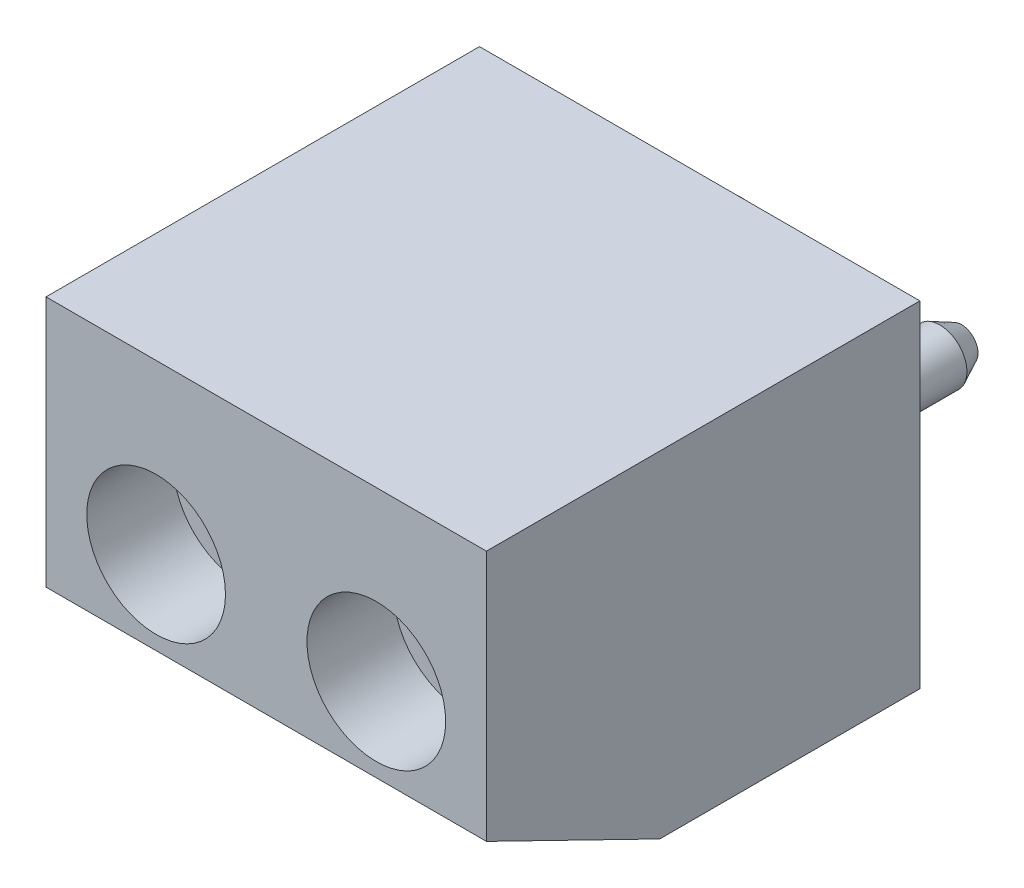
ISO-10303-21;
HEADER;
FILE_DESCRIPTION(('STEP AP214'),'2;1');
FILE_NAME('part.step','',(''),(''),'','','');
FILE_SCHEMA(('AUTOMOTIVE_DESIGN { 1 0 10303 214 1 1 1 1 }'));
ENDSEC;
DATA;
#1=APPLICATION_CONTEXT('core data for automotive mechanical design processes');
#2=APPLICATION_PROTOCOL_DEFINITION('international standard','automotive_design',2000,#1);
#3=PRODUCT_CONTEXT('',#1,'mechanical');
#4=PRODUCT('Part','Part','',(#3));
#5=PRODUCT_RELATED_PRODUCT_CATEGORY('part','',(#4));
#6=PRODUCT_DEFINITION_FORMATION('','',#4);
#7=PRODUCT_DEFINITION_CONTEXT('part definition',#1,'design');
#8=PRODUCT_DEFINITION('design','',#6,#7);
#9=PRODUCT_DEFINITION_SHAPE('','',#8);
#10=(LENGTH_UNIT() NAMED_UNIT(*) SI_UNIT(.MILLI.,.METRE.));
#11=(NAMED_UNIT(*) PLANE_ANGLE_UNIT() SI_UNIT($,.RADIAN.));
#12=(NAMED_UNIT(*) SI_UNIT($,.STERADIAN.) SOLID_ANGLE_UNIT());
#13=UNCERTAINTY_MEASURE_WITH_UNIT(LENGTH_MEASURE(1.E-05),#10,'distance_accuracy_value','');
#14=(GEOMETRIC_REPRESENTATION_CONTEXT(3) GLOBAL_UNCERTAINTY_ASSIGNED_CONTEXT((#13)) GLOBAL_UNIT_ASSIGNED_CONTEXT((#10,
#11,#12)) REPRESENTATION_CONTEXT('',''));
#15=CARTESIAN_POINT('',(0.,0.,0.));
#16=DIRECTION('',(0.,0.,1.));
#17=DIRECTION('',(1.,0.,0.));
#18=AXIS2_PLACEMENT_3D('',#15,#16,#17);
#19=CARTESIAN_POINT('',(-5.08,-3.875,10.));
#20=DIRECTION('',(1.,0.,0.));
#21=DIRECTION('',(0.,0.,-1.));
#22=AXIS2_PLACEMENT_3D('',#19,#20,#21);
#23=PLANE('',#22);
#24=DIRECTION('',(0.,0.,-1.));
#25=VECTOR('',#24,1.);
#26=CARTESIAN_POINT('',(-5.08,-3.875,10.));
#27=LINE('',#26,#25);
#28=CARTESIAN_POINT('',(-5.08,-3.875,5.99999999999997));
#29=VERTEX_POINT('',#28);
#30=CARTESIAN_POINT('',(-5.08,-3.875,0.));
#31=VERTEX_POINT('',#30);
#32=EDGE_CURVE('E237',#29,#31,#27,.T.);
#33=ORIENTED_EDGE('',*,*,#32,.F.);
#34=DIRECTION('',(0.,-0.438371146789075,-0.898794046299168));
#35=VECTOR('',#34,1.);
#36=CARTESIAN_POINT('',(-5.08,-1.92406964573655,10.));
#37=LINE('',#36,#35);
#38=CARTESIAN_POINT('',(-5.08,-1.92406964573655,10.));
#39=VERTEX_POINT('',#38);
#40=EDGE_CURVE('E246',#29,#39,#37,.F.);
#41=ORIENTED_EDGE('',*,*,#40,.T.);
#42=DIRECTION('',(0.,-1.,0.));
#43=VECTOR('',#42,1.);
#44=CARTESIAN_POINT('',(-5.08,-3.875,10.));
#45=LINE('',#44,#43);
#46=CARTESIAN_POINT('',(-5.08,3.875,10.));
#47=VERTEX_POINT('',#46);
#48=EDGE_CURVE('E213',#47,#39,#45,.T.);
#49=ORIENTED_EDGE('',*,*,#48,.F.);
#50=DIRECTION('',(0.,0.,-1.));
#51=VECTOR('',#50,1.);
#52=CARTESIAN_POINT('',(-5.08,3.875,10.));
#53=LINE('',#52,#51);
#54=CARTESIAN_POINT('',(-5.08,3.875,0.));
#55=VERTEX_POINT('',#54);
#56=EDGE_CURVE('E221',#47,#55,#53,.T.);
#57=ORIENTED_EDGE('',*,*,#56,.T.);
#58=DIRECTION('',(0.,-1.,0.));
#59=VECTOR('',#58,1.);
#60=CARTESIAN_POINT('',(-5.08,-3.875,0.));
#61=LINE('',#60,#59);
#62=EDGE_CURVE('E204',#55,#31,#61,.T.);
#63=ORIENTED_EDGE('',*,*,#62,.T.);
#64=EDGE_LOOP('',(#33,#41,#49,#57,#63));
#65=FACE_BOUND('',#64,.T.);
#66=ADVANCED_FACE('F33',(#65),#23,.F.);
#67=CARTESIAN_POINT('',(-5.08,-3.875,10.));
#68=DIRECTION('',(0.,1.,0.));
#69=DIRECTION('',(-1.,0.,0.));
#70=AXIS2_PLACEMENT_3D('',#67,#68,#69);
#71=PLANE('',#70);
#72=DIRECTION('',(1.,0.,0.));
#73=VECTOR('',#72,1.);
#74=CARTESIAN_POINT('',(-4.83,-3.875,0.25));
#75=LINE('',#74,#73);
#76=CARTESIAN_POINT('',(-4.83,-3.875,0.25));
#77=VERTEX_POINT('',#76);
#78=CARTESIAN_POINT('',(-0.250000000000001,-3.875,0.25));
#79=VERTEX_POINT('',#78);
#80=EDGE_CURVE('E160',#77,#79,#75,.T.);
#81=ORIENTED_EDGE('',*,*,#80,.F.);
#82=DIRECTION('',(0.,0.,-1.));
#83=VECTOR('',#82,1.);
#84=CARTESIAN_POINT('',(-4.83,-3.875,5.74999999999997));
#85=LINE('',#84,#83);
#86=CARTESIAN_POINT('',(-4.83,-3.875,5.74999999999997));
#87=VERTEX_POINT('',#86);
#88=EDGE_CURVE('E48',#87,#77,#85,.T.);
#89=ORIENTED_EDGE('',*,*,#88,.F.);
#90=DIRECTION('',(-1.,0.,0.));
#91=VECTOR('',#90,1.);
#92=CARTESIAN_POINT('',(-4.83,-3.875,5.74999999999997));
#93=LINE('',#92,#91);
#94=CARTESIAN_POINT('',(-0.250000000000001,-3.875,5.74999999999997));
#95=VERTEX_POINT('',#94);
#96=EDGE_CURVE('E148',#95,#87,#93,.T.);
#97=ORIENTED_EDGE('',*,*,#96,.F.);
#98=DIRECTION('',(0.,0.,1.));
#99=VECTOR('',#98,1.);
#100=CARTESIAN_POINT('',(-0.250000000000001,-3.875,5.74999999999997));
#101=LINE('',#100,#99);
#102=EDGE_CURVE('E151',#79,#95,#101,.T.);
#103=ORIENTED_EDGE('',*,*,#102,.F.);
#104=EDGE_LOOP('',(#81,#89,#97,#103));
#105=FACE_BOUND('',#104,.T.);
#106=DIRECTION('',(1.,0.,0.));
#107=VECTOR('',#106,1.);
#108=CARTESIAN_POINT('',(0.25,-3.875,0.25));
#109=LINE('',#108,#107);
#110=CARTESIAN_POINT('',(0.25,-3.875,0.25));
#111=VERTEX_POINT('',#110);
#112=CARTESIAN_POINT('',(4.83,-3.875,0.25));
#113=VERTEX_POINT('',#112);
#114=EDGE_CURVE('E186',#111,#113,#109,.T.);
#115=ORIENTED_EDGE('',*,*,#114,.F.);
#116=DIRECTION('',(0.,0.,-1.));
#117=VECTOR('',#116,1.);
#118=CARTESIAN_POINT('',(0.25,-3.875,5.74999999999997));
#119=LINE('',#118,#117);
#120=CARTESIAN_POINT('',(0.25,-3.875,5.74999999999997));
#121=VERTEX_POINT('',#120);
#122=EDGE_CURVE('E56',#121,#111,#119,.T.);
#123=ORIENTED_EDGE('',*,*,#122,.F.);
#124=DIRECTION('',(-1.,0.,0.));
#125=VECTOR('',#124,1.);
#126=CARTESIAN_POINT('',(0.25,-3.875,5.74999999999997));
#127=LINE('',#126,#125);
#128=CARTESIAN_POINT('',(4.83,-3.875,5.74999999999997));
#129=VERTEX_POINT('',#128);
#130=EDGE_CURVE('E175',#129,#121,#127,.T.);
#131=ORIENTED_EDGE('',*,*,#130,.F.);
#132=DIRECTION('',(0.,0.,1.));
#133=VECTOR('',#132,1.);
#134=CARTESIAN_POINT('',(4.83,-3.875,5.74999999999997));
#135=LINE('',#134,#133);
#136=EDGE_CURVE('E190',#113,#129,#135,.T.);
#137=ORIENTED_EDGE('',*,*,#136,.F.);
#138=EDGE_LOOP('',(#115,#123,#131,#137));
#139=FACE_BOUND('',#138,.T.);
#140=DIRECTION('',(0.,0.,-1.));
#141=VECTOR('',#140,1.);
#142=CARTESIAN_POINT('',(5.08,-3.875,10.));
#143=LINE('',#142,#141);
#144=CARTESIAN_POINT('',(5.08,-3.875,5.99999999999997));
#145=VERTEX_POINT('',#144);
#146=CARTESIAN_POINT('',(5.08,-3.875,0.));
#147=VERTEX_POINT('',#146);
#148=EDGE_CURVE('E235',#145,#147,#143,.T.);
#149=ORIENTED_EDGE('',*,*,#148,.F.);
#150=DIRECTION('',(-1.,0.,0.));
#151=VECTOR('',#150,1.);
#152=CARTESIAN_POINT('',(-5.08,-3.875,5.99999999999997));
#153=LINE('',#152,#151);
#154=EDGE_CURVE('E244',#145,#29,#153,.T.);
#155=ORIENTED_EDGE('',*,*,#154,.T.);
#156=ORIENTED_EDGE('',*,*,#32,.T.);
#157=DIRECTION('',(1.,0.,0.));
#158=VECTOR('',#157,1.);
#159=CARTESIAN_POINT('',(-5.08,-3.875,0.));
#160=LINE('',#159,#158);
#161=EDGE_CURVE('E224',#31,#147,#160,.T.);
#162=ORIENTED_EDGE('',*,*,#161,.T.);
#163=EDGE_LOOP('',(#149,#155,#156,#162));
#164=FACE_BOUND('',#163,.T.);
#165=ADVANCED_FACE('F268',(#105,#139,#164),#71,.F.);
#166=CARTESIAN_POINT('',(5.08,-3.875,10.));
#167=DIRECTION('',(-1.,0.,0.));
#168=DIRECTION('',(0.,-1.,0.));
#169=AXIS2_PLACEMENT_3D('',#166,#167,#168);
#170=PLANE('',#169);
#171=DIRECTION('',(0.,1.,0.));
#172=VECTOR('',#171,1.);
#173=CARTESIAN_POINT('',(5.08,-3.875,10.));
#174=LINE('',#173,#172);
#175=CARTESIAN_POINT('',(5.08,-1.92406964573655,10.));
#176=VERTEX_POINT('',#175);
#177=CARTESIAN_POINT('',(5.08,3.875,10.));
#178=VERTEX_POINT('',#177);
#179=EDGE_CURVE('E216',#176,#178,#174,.T.);
#180=ORIENTED_EDGE('',*,*,#179,.F.);
#181=DIRECTION('',(0.,0.438371146789075,0.898794046299168));
#182=VECTOR('',#181,1.);
#183=CARTESIAN_POINT('',(5.08,-1.92406964573655,10.));
#184=LINE('',#183,#182);
#185=EDGE_CURVE('E242',#176,#145,#184,.F.);
#186=ORIENTED_EDGE('',*,*,#185,.T.);
#187=ORIENTED_EDGE('',*,*,#148,.T.);
#188=DIRECTION('',(0.,1.,0.));
#189=VECTOR('',#188,1.);
#190=CARTESIAN_POINT('',(5.08,-3.875,0.));
#191=LINE('',#190,#189);
#192=CARTESIAN_POINT('',(5.08,3.875,0.));
#193=VERTEX_POINT('',#192);
#194=EDGE_CURVE('E227',#147,#193,#191,.T.);
#195=ORIENTED_EDGE('',*,*,#194,.T.);
#196=DIRECTION('',(0.,0.,-1.));
#197=VECTOR('',#196,1.);
#198=CARTESIAN_POINT('',(5.08,3.875,10.));
#199=LINE('',#198,#197);
#200=EDGE_CURVE('E232',#178,#193,#199,.T.);
#201=ORIENTED_EDGE('',*,*,#200,.F.);
#202=EDGE_LOOP('',(#180,#186,#187,#195,#201));
#203=FACE_BOUND('',#202,.T.);
#204=ADVANCED_FACE('F274',(#203),#170,.F.);
#205=CARTESIAN_POINT('',(-5.08,3.875,10.));
#206=DIRECTION('',(0.,-1.,0.));
#207=DIRECTION('',(1.,0.,0.));
#208=AXIS2_PLACEMENT_3D('',#205,#206,#207);
#209=PLANE('',#208);
#210=DIRECTION('',(-1.,0.,0.));
#211=VECTOR('',#210,1.);
#212=CARTESIAN_POINT('',(-5.08,3.875,0.));
#213=LINE('',#212,#211);
#214=EDGE_CURVE('E217',#193,#55,#213,.T.);
#215=ORIENTED_EDGE('',*,*,#214,.T.);
#216=ORIENTED_EDGE('',*,*,#56,.F.);
#217=DIRECTION('',(-1.,0.,0.));
#218=VECTOR('',#217,1.);
#219=CARTESIAN_POINT('',(-5.08,3.875,10.));
#220=LINE('',#219,#218);
#221=EDGE_CURVE('E219',#178,#47,#220,.T.);
#222=ORIENTED_EDGE('',*,*,#221,.F.);
#223=ORIENTED_EDGE('',*,*,#200,.T.);
#224=EDGE_LOOP('',(#215,#216,#222,#223));
#225=FACE_BOUND('',#224,.T.);
#226=ADVANCED_FACE('F305',(#225),#209,.F.);
#227=CARTESIAN_POINT('',(0.,0.,10.));
#228=DIRECTION('',(0.,0.,-1.));
#229=DIRECTION('',(-1.,0.,0.));
#230=AXIS2_PLACEMENT_3D('',#227,#228,#229);
#231=PLANE('',#230);
#232=CARTESIAN_POINT('',(-2.54,0.,10.));
#233=DIRECTION('',(0.,0.,1.));
#234=DIRECTION('',(1.,0.,0.));
#235=AXIS2_PLACEMENT_3D('',#232,#233,#234);
#236=CIRCLE('',#235,1.6);
#237=CARTESIAN_POINT('',(-0.94,0.,10.));
#238=VERTEX_POINT('',#237);
#239=EDGE_CURVE('E205',#238,#238,#236,.T.);
#240=ORIENTED_EDGE('',*,*,#239,.F.);
#241=EDGE_LOOP('',(#240));
#242=FACE_BOUND('',#241,.T.);
#243=CARTESIAN_POINT('',(2.54,0.,10.));
#244=DIRECTION('',(0.,0.,1.));
#245=DIRECTION('',(1.,0.,0.));
#246=AXIS2_PLACEMENT_3D('',#243,#244,#245);
#247=CIRCLE('',#246,1.6);
#248=CARTESIAN_POINT('',(4.14,0.,10.));
#249=VERTEX_POINT('',#248);
#250=EDGE_CURVE('E167',#249,#249,#247,.T.);
#251=ORIENTED_EDGE('',*,*,#250,.F.);
#252=EDGE_LOOP('',(#251));
#253=FACE_BOUND('',#252,.T.);
#254=ORIENTED_EDGE('',*,*,#48,.T.);
#255=DIRECTION('',(1.,0.,0.));
#256=VECTOR('',#255,1.);
#257=CARTESIAN_POINT('',(0.,-1.92406964573655,10.));
#258=LINE('',#257,#256);
#259=EDGE_CURVE('E239',#39,#176,#258,.T.);
#260=ORIENTED_EDGE('',*,*,#259,.T.);
#261=ORIENTED_EDGE('',*,*,#179,.T.);
#262=ORIENTED_EDGE('',*,*,#221,.T.);
#263=EDGE_LOOP('',(#254,#260,#261,#262));
#264=FACE_BOUND('',#263,.T.);
#265=ADVANCED_FACE('F292',(#242,#253,#264),#231,.F.);
#266=CARTESIAN_POINT('',(0.,0.,0.));
#267=DIRECTION('',(0.,0.,-1.));
#268=DIRECTION('',(-1.,0.,0.));
#269=AXIS2_PLACEMENT_3D('',#266,#267,#268);
#270=PLANE('',#269);
#271=CARTESIAN_POINT('',(2.54,0.,0.));
#272=DIRECTION('',(0.,0.,-1.));
#273=DIRECTION('',(-1.,0.,0.));
#274=AXIS2_PLACEMENT_3D('',#271,#272,#273);
#275=CIRCLE('',#274,0.625);
#276=CARTESIAN_POINT('',(1.915,0.,0.));
#277=VERTEX_POINT('',#276);
#278=EDGE_CURVE('E580',#277,#277,#275,.T.);
#279=ORIENTED_EDGE('',*,*,#278,.F.);
#280=EDGE_LOOP('',(#279));
#281=FACE_BOUND('',#280,.T.);
#282=CARTESIAN_POINT('',(-2.54,0.,0.));
#283=DIRECTION('',(0.,0.,-1.));
#284=DIRECTION('',(-1.,0.,0.));
#285=AXIS2_PLACEMENT_3D('',#282,#283,#284);
#286=CIRCLE('',#285,0.625);
#287=CARTESIAN_POINT('',(-3.165,0.,0.));
#288=VERTEX_POINT('',#287);
#289=EDGE_CURVE('E581',#288,#288,#286,.T.);
#290=ORIENTED_EDGE('',*,*,#289,.F.);
#291=EDGE_LOOP('',(#290));
#292=FACE_BOUND('',#291,.T.);
#293=ORIENTED_EDGE('',*,*,#62,.F.);
#294=ORIENTED_EDGE('',*,*,#214,.F.);
#295=ORIENTED_EDGE('',*,*,#194,.F.);
#296=ORIENTED_EDGE('',*,*,#161,.F.);
#297=EDGE_LOOP('',(#293,#294,#295,#296));
#298=FACE_BOUND('',#297,.T.);
#299=ADVANCED_FACE('F283',(#281,#292,#298),#270,.T.);
#300=CARTESIAN_POINT('',(0.,-1.92406964573655,10.));
#301=DIRECTION('',(0.,0.898794046299168,-0.438371146789075));
#302=DIRECTION('',(1.,0.,0.));
#303=AXIS2_PLACEMENT_3D('',#300,#301,#302);
#304=PLANE('',#303);
#305=ORIENTED_EDGE('',*,*,#40,.F.);
#306=ORIENTED_EDGE('',*,*,#154,.F.);
#307=ORIENTED_EDGE('',*,*,#185,.F.);
#308=ORIENTED_EDGE('',*,*,#259,.F.);
#309=EDGE_LOOP('',(#305,#306,#307,#308));
#310=FACE_BOUND('',#309,.T.);
#311=ADVANCED_FACE('F280',(#310),#304,.F.);
#312=CARTESIAN_POINT('',(2.54,0.,8.));
#313=DIRECTION('',(0.,0.,1.));
#314=DIRECTION('',(1.,0.,0.));
#315=AXIS2_PLACEMENT_3D('',#312,#313,#314);
#316=CYLINDRICAL_SURFACE('',#315,1.6);
#317=CARTESIAN_POINT('',(2.54,0.,8.));
#318=DIRECTION('',(0.,0.,1.));
#319=DIRECTION('',(1.,0.,0.));
#320=AXIS2_PLACEMENT_3D('',#317,#318,#319);
#321=CIRCLE('',#320,1.6);
#322=CARTESIAN_POINT('',(4.14,0.,8.));
#323=VERTEX_POINT('',#322);
#324=EDGE_CURVE('E208',#323,#323,#321,.T.);
#325=ORIENTED_EDGE('',*,*,#324,.F.);
#326=EDGE_LOOP('',(#325));
#327=FACE_BOUND('',#326,.T.);
#328=ORIENTED_EDGE('',*,*,#250,.T.);
#329=EDGE_LOOP('',(#328));
#330=FACE_BOUND('',#329,.T.);
#331=ADVANCED_FACE('F282',(#327,#330),#316,.F.);
#332=CARTESIAN_POINT('',(2.54,0.,8.));
#333=DIRECTION('',(0.,0.,1.));
#334=DIRECTION('',(1.,0.,0.));
#335=AXIS2_PLACEMENT_3D('',#332,#333,#334);
#336=PLANE('',#335);
#337=ORIENTED_EDGE('',*,*,#324,.T.);
#338=EDGE_LOOP('',(#337));
#339=FACE_BOUND('',#338,.T.);
#340=ADVANCED_FACE('F289',(#339),#336,.T.);
#341=CARTESIAN_POINT('',(-2.54,0.,8.));
#342=DIRECTION('',(0.,0.,1.));
#343=DIRECTION('',(1.,0.,0.));
#344=AXIS2_PLACEMENT_3D('',#341,#342,#343);
#345=CYLINDRICAL_SURFACE('',#344,1.6);
#346=CARTESIAN_POINT('',(-2.54,0.,8.));
#347=DIRECTION('',(0.,0.,1.));
#348=DIRECTION('',(1.,0.,0.));
#349=AXIS2_PLACEMENT_3D('',#346,#347,#348);
#350=CIRCLE('',#349,1.6);
#351=CARTESIAN_POINT('',(-0.94,0.,8.));
#352=VERTEX_POINT('',#351);
#353=EDGE_CURVE('E201',#352,#352,#350,.T.);
#354=ORIENTED_EDGE('',*,*,#353,.F.);
#355=EDGE_LOOP('',(#354));
#356=FACE_BOUND('',#355,.T.);
#357=ORIENTED_EDGE('',*,*,#239,.T.);
#358=EDGE_LOOP('',(#357));
#359=FACE_BOUND('',#358,.T.);
#360=ADVANCED_FACE('F325',(#356,#359),#345,.F.);
#361=CARTESIAN_POINT('',(-2.54,0.,8.));
#362=DIRECTION('',(0.,0.,1.));
#363=DIRECTION('',(1.,0.,0.));
#364=AXIS2_PLACEMENT_3D('',#361,#362,#363);
#365=PLANE('',#364);
#366=ORIENTED_EDGE('',*,*,#353,.T.);
#367=EDGE_LOOP('',(#366));
#368=FACE_BOUND('',#367,.T.);
#369=ADVANCED_FACE('F329',(#368),#365,.T.);
#370=CARTESIAN_POINT('',(0.25,-2.875,5.74999999999997));
#371=DIRECTION('',(-1.,0.,0.));
#372=DIRECTION('',(0.,0.,1.));
#373=AXIS2_PLACEMENT_3D('',#370,#371,#372);
#374=PLANE('',#373);
#375=ORIENTED_EDGE('',*,*,#122,.T.);
#376=DIRECTION('',(0.,-1.,0.));
#377=VECTOR('',#376,1.);
#378=CARTESIAN_POINT('',(0.25,-2.875,0.25));
#379=LINE('',#378,#377);
#380=CARTESIAN_POINT('',(0.25,-2.875,0.25));
#381=VERTEX_POINT('',#380);
#382=EDGE_CURVE('E184',#381,#111,#379,.T.);
#383=ORIENTED_EDGE('',*,*,#382,.F.);
#384=DIRECTION('',(0.,0.,-1.));
#385=VECTOR('',#384,1.);
#386=CARTESIAN_POINT('',(0.25,-2.875,5.74999999999997));
#387=LINE('',#386,#385);
#388=CARTESIAN_POINT('',(0.25,-2.875,5.74999999999997));
#389=VERTEX_POINT('',#388);
#390=EDGE_CURVE('E171',#389,#381,#387,.T.);
#391=ORIENTED_EDGE('',*,*,#390,.F.);
#392=DIRECTION('',(0.,-1.,0.));
#393=VECTOR('',#392,1.);
#394=CARTESIAN_POINT('',(0.25,-2.875,5.74999999999997));
#395=LINE('',#394,#393);
#396=EDGE_CURVE('E161',#389,#121,#395,.T.);
#397=ORIENTED_EDGE('',*,*,#396,.T.);
#398=EDGE_LOOP('',(#375,#383,#391,#397));
#399=FACE_BOUND('',#398,.T.);
#400=ADVANCED_FACE('F333',(#399),#374,.F.);
#401=CARTESIAN_POINT('',(0.25,-2.875,5.74999999999997));
#402=DIRECTION('',(0.,0.,1.));
#403=DIRECTION('',(1.,0.,0.));
#404=AXIS2_PLACEMENT_3D('',#401,#402,#403);
#405=PLANE('',#404);
#406=ORIENTED_EDGE('',*,*,#130,.T.);
#407=ORIENTED_EDGE('',*,*,#396,.F.);
#408=DIRECTION('',(-1.,0.,0.));
#409=VECTOR('',#408,1.);
#410=CARTESIAN_POINT('',(0.25,-2.875,5.74999999999997));
#411=LINE('',#410,#409);
#412=CARTESIAN_POINT('',(4.83,-2.875,5.74999999999997));
#413=VERTEX_POINT('',#412);
#414=EDGE_CURVE('E181',#413,#389,#411,.T.);
#415=ORIENTED_EDGE('',*,*,#414,.F.);
#416=DIRECTION('',(0.,-1.,0.));
#417=VECTOR('',#416,1.);
#418=CARTESIAN_POINT('',(4.83,-2.875,5.74999999999997));
#419=LINE('',#418,#417);
#420=EDGE_CURVE('E196',#413,#129,#419,.T.);
#421=ORIENTED_EDGE('',*,*,#420,.T.);
#422=EDGE_LOOP('',(#406,#407,#415,#421));
#423=FACE_BOUND('',#422,.T.);
#424=ADVANCED_FACE('F337',(#423),#405,.F.);
#425=CARTESIAN_POINT('',(4.83,-2.875,5.74999999999997));
#426=DIRECTION('',(1.,0.,0.));
#427=DIRECTION('',(0.,0.,-1.));
#428=AXIS2_PLACEMENT_3D('',#425,#426,#427);
#429=PLANE('',#428);
#430=ORIENTED_EDGE('',*,*,#136,.T.);
#431=ORIENTED_EDGE('',*,*,#420,.F.);
#432=DIRECTION('',(0.,0.,1.));
#433=VECTOR('',#432,1.);
#434=CARTESIAN_POINT('',(4.83,-2.875,5.74999999999997));
#435=LINE('',#434,#433);
#436=CARTESIAN_POINT('',(4.83,-2.875,0.25));
#437=VERTEX_POINT('',#436);
#438=EDGE_CURVE('E178',#437,#413,#435,.T.);
#439=ORIENTED_EDGE('',*,*,#438,.F.);
#440=DIRECTION('',(0.,-1.,0.));
#441=VECTOR('',#440,1.);
#442=CARTESIAN_POINT('',(4.83,-2.875,0.25));
#443=LINE('',#442,#441);
#444=EDGE_CURVE('E198',#437,#113,#443,.T.);
#445=ORIENTED_EDGE('',*,*,#444,.T.);
#446=EDGE_LOOP('',(#430,#431,#439,#445));
#447=FACE_BOUND('',#446,.T.);
#448=ADVANCED_FACE('F342',(#447),#429,.F.);
#449=CARTESIAN_POINT('',(0.25,-2.875,0.25));
#450=DIRECTION('',(0.,0.,-1.));
#451=DIRECTION('',(-1.,0.,0.));
#452=AXIS2_PLACEMENT_3D('',#449,#450,#451);
#453=PLANE('',#452);
#454=ORIENTED_EDGE('',*,*,#114,.T.);
#455=ORIENTED_EDGE('',*,*,#444,.F.);
#456=DIRECTION('',(1.,0.,0.));
#457=VECTOR('',#456,1.);
#458=CARTESIAN_POINT('',(0.25,-2.875,0.25));
#459=LINE('',#458,#457);
#460=EDGE_CURVE('E174',#381,#437,#459,.T.);
#461=ORIENTED_EDGE('',*,*,#460,.F.);
#462=ORIENTED_EDGE('',*,*,#382,.T.);
#463=EDGE_LOOP('',(#454,#455,#461,#462));
#464=FACE_BOUND('',#463,.T.);
#465=ADVANCED_FACE('F338',(#464),#453,.F.);
#466=CARTESIAN_POINT('',(0.,-2.875,0.));
#467=DIRECTION('',(0.,-1.,0.));
#468=DIRECTION('',(1.,0.,0.));
#469=AXIS2_PLACEMENT_3D('',#466,#467,#468);
#470=PLANE('',#469);
#471=CARTESIAN_POINT('',(2.54,-2.875,2.5));
#472=DIRECTION('',(0.,-1.,0.));
#473=DIRECTION('',(1.,0.,0.));
#474=AXIS2_PLACEMENT_3D('',#471,#472,#473);
#475=CIRCLE('',#474,1.9);
#476=CARTESIAN_POINT('',(4.44,-2.875,2.5));
#477=VERTEX_POINT('',#476);
#478=EDGE_CURVE('E154',#477,#477,#475,.T.);
#479=ORIENTED_EDGE('',*,*,#478,.F.);
#480=EDGE_LOOP('',(#479));
#481=FACE_BOUND('',#480,.T.);
#482=ORIENTED_EDGE('',*,*,#390,.T.);
#483=ORIENTED_EDGE('',*,*,#460,.T.);
#484=ORIENTED_EDGE('',*,*,#438,.T.);
#485=ORIENTED_EDGE('',*,*,#414,.T.);
#486=EDGE_LOOP('',(#482,#483,#484,#485));
#487=FACE_BOUND('',#486,.T.);
#488=ADVANCED_FACE('F341',(#481,#487),#470,.T.);
#489=CARTESIAN_POINT('',(-4.83,-2.875,5.74999999999997));
#490=DIRECTION('',(-1.,0.,0.));
#491=DIRECTION('',(0.,0.,1.));
#492=AXIS2_PLACEMENT_3D('',#489,#490,#491);
#493=PLANE('',#492);
#494=ORIENTED_EDGE('',*,*,#88,.T.);
#495=DIRECTION('',(0.,-1.,0.));
#496=VECTOR('',#495,1.);
#497=CARTESIAN_POINT('',(-4.83,-2.875,0.25));
#498=LINE('',#497,#496);
#499=CARTESIAN_POINT('',(-4.83,-2.875,0.25));
#500=VERTEX_POINT('',#499);
#501=EDGE_CURVE('E126',#500,#77,#498,.T.);
#502=ORIENTED_EDGE('',*,*,#501,.F.);
#503=DIRECTION('',(0.,0.,-1.));
#504=VECTOR('',#503,1.);
#505=CARTESIAN_POINT('',(-4.83,-2.875,5.74999999999997));
#506=LINE('',#505,#504);
#507=CARTESIAN_POINT('',(-4.83,-2.875,5.74999999999997));
#508=VERTEX_POINT('',#507);
#509=EDGE_CURVE('E130',#508,#500,#506,.T.);
#510=ORIENTED_EDGE('',*,*,#509,.F.);
#511=DIRECTION('',(0.,-1.,0.));
#512=VECTOR('',#511,1.);
#513=CARTESIAN_POINT('',(-4.83,-2.875,5.74999999999997));
#514=LINE('',#513,#512);
#515=EDGE_CURVE('E165',#508,#87,#514,.T.);
#516=ORIENTED_EDGE('',*,*,#515,.T.);
#517=EDGE_LOOP('',(#494,#502,#510,#516));
#518=FACE_BOUND('',#517,.T.);
#519=ADVANCED_FACE('F128',(#518),#493,.F.);
#520=CARTESIAN_POINT('',(-4.83,-2.875,5.74999999999997));
#521=DIRECTION('',(0.,0.,1.));
#522=DIRECTION('',(1.,0.,0.));
#523=AXIS2_PLACEMENT_3D('',#520,#521,#522);
#524=PLANE('',#523);
#525=ORIENTED_EDGE('',*,*,#96,.T.);
#526=ORIENTED_EDGE('',*,*,#515,.F.);
#527=DIRECTION('',(-1.,0.,0.));
#528=VECTOR('',#527,1.);
#529=CARTESIAN_POINT('',(-4.83,-2.875,5.74999999999997));
#530=LINE('',#529,#528);
#531=CARTESIAN_POINT('',(-0.25,-2.875,5.74999999999997));
#532=VERTEX_POINT('',#531);
#533=EDGE_CURVE('E136',#532,#508,#530,.T.);
#534=ORIENTED_EDGE('',*,*,#533,.F.);
#535=DIRECTION('',(0.,-1.,0.));
#536=VECTOR('',#535,1.);
#537=CARTESIAN_POINT('',(-0.25,-2.875,5.74999999999997));
#538=LINE('',#537,#536);
#539=EDGE_CURVE('E168',#532,#95,#538,.T.);
#540=ORIENTED_EDGE('',*,*,#539,.T.);
#541=EDGE_LOOP('',(#525,#526,#534,#540));
#542=FACE_BOUND('',#541,.T.);
#543=ADVANCED_FACE('F355',(#542),#524,.F.);
#544=CARTESIAN_POINT('',(-0.25,-2.875,5.74999999999997));
#545=DIRECTION('',(1.,0.,0.));
#546=DIRECTION('',(0.,0.,-1.));
#547=AXIS2_PLACEMENT_3D('',#544,#545,#546);
#548=PLANE('',#547);
#549=ORIENTED_EDGE('',*,*,#102,.T.);
#550=ORIENTED_EDGE('',*,*,#539,.F.);
#551=DIRECTION('',(0.,0.,1.));
#552=VECTOR('',#551,1.);
#553=CARTESIAN_POINT('',(-0.25,-2.875,5.74999999999997));
#554=LINE('',#553,#552);
#555=CARTESIAN_POINT('',(-0.250000000000001,-2.875,0.25));
#556=VERTEX_POINT('',#555);
#557=EDGE_CURVE('E144',#556,#532,#554,.T.);
#558=ORIENTED_EDGE('',*,*,#557,.F.);
#559=DIRECTION('',(0.,-1.,0.));
#560=VECTOR('',#559,1.);
#561=CARTESIAN_POINT('',(-0.250000000000001,-2.875,0.25));
#562=LINE('',#561,#560);
#563=EDGE_CURVE('E135',#556,#79,#562,.T.);
#564=ORIENTED_EDGE('',*,*,#563,.T.);
#565=EDGE_LOOP('',(#549,#550,#558,#564));
#566=FACE_BOUND('',#565,.T.);
#567=ADVANCED_FACE('F358',(#566),#548,.F.);
#568=CARTESIAN_POINT('',(-4.83,-2.875,0.25));
#569=DIRECTION('',(0.,0.,-1.));
#570=DIRECTION('',(-1.,0.,0.));
#571=AXIS2_PLACEMENT_3D('',#568,#569,#570);
#572=PLANE('',#571);
#573=ORIENTED_EDGE('',*,*,#80,.T.);
#574=ORIENTED_EDGE('',*,*,#563,.F.);
#575=DIRECTION('',(1.,0.,0.));
#576=VECTOR('',#575,1.);
#577=CARTESIAN_POINT('',(-4.83,-2.875,0.25));
#578=LINE('',#577,#576);
#579=EDGE_CURVE('E139',#500,#556,#578,.T.);
#580=ORIENTED_EDGE('',*,*,#579,.F.);
#581=ORIENTED_EDGE('',*,*,#501,.T.);
#582=EDGE_LOOP('',(#573,#574,#580,#581));
#583=FACE_BOUND('',#582,.T.);
#584=ADVANCED_FACE('F140',(#583),#572,.F.);
#585=CARTESIAN_POINT('',(0.,-2.875,0.));
#586=DIRECTION('',(0.,-1.,0.));
#587=DIRECTION('',(1.,0.,0.));
#588=AXIS2_PLACEMENT_3D('',#585,#586,#587);
#589=PLANE('',#588);
#590=CARTESIAN_POINT('',(-2.54,-2.875,2.5));
#591=DIRECTION('',(0.,-1.,0.));
#592=DIRECTION('',(1.,0.,0.));
#593=AXIS2_PLACEMENT_3D('',#590,#591,#592);
#594=CIRCLE('',#593,1.9);
#595=CARTESIAN_POINT('',(-0.640000000000001,-2.875,2.5));
#596=VERTEX_POINT('',#595);
#597=EDGE_CURVE('E588',#596,#596,#594,.T.);
#598=ORIENTED_EDGE('',*,*,#597,.F.);
#599=EDGE_LOOP('',(#598));
#600=FACE_BOUND('',#599,.T.);
#601=ORIENTED_EDGE('',*,*,#509,.T.);
#602=ORIENTED_EDGE('',*,*,#579,.T.);
#603=ORIENTED_EDGE('',*,*,#557,.T.);
#604=ORIENTED_EDGE('',*,*,#533,.T.);
#605=EDGE_LOOP('',(#601,#602,#603,#604));
#606=FACE_BOUND('',#605,.T.);
#607=ADVANCED_FACE('F146',(#600,#606),#589,.T.);
#608=CARTESIAN_POINT('',(-2.54,2.125,2.5));
#609=DIRECTION('',(0.,-1.,0.));
#610=DIRECTION('',(1.,0.,0.));
#611=AXIS2_PLACEMENT_3D('',#608,#609,#610);
#612=CYLINDRICAL_SURFACE('',#611,1.9);
#613=CARTESIAN_POINT('',(-2.54,2.125,2.5));
#614=DIRECTION('',(0.,-1.,0.));
#615=DIRECTION('',(1.,0.,0.));
#616=AXIS2_PLACEMENT_3D('',#613,#614,#615);
#617=CIRCLE('',#616,1.9);
#618=CARTESIAN_POINT('',(-0.64,2.125,2.5));
#619=VERTEX_POINT('',#618);
#620=EDGE_CURVE('E187',#619,#619,#617,.T.);
#621=ORIENTED_EDGE('',*,*,#620,.F.);
#622=EDGE_LOOP('',(#621));
#623=FACE_BOUND('',#622,.T.);
#624=ORIENTED_EDGE('',*,*,#597,.T.);
#625=EDGE_LOOP('',(#624));
#626=FACE_BOUND('',#625,.T.);
#627=ADVANCED_FACE('F367',(#623,#626),#612,.F.);
#628=CARTESIAN_POINT('',(-2.54,2.125,2.5));
#629=DIRECTION('',(0.,-1.,0.));
#630=DIRECTION('',(1.,0.,0.));
#631=AXIS2_PLACEMENT_3D('',#628,#629,#630);
#632=PLANE('',#631);
#633=ORIENTED_EDGE('',*,*,#620,.T.);
#634=EDGE_LOOP('',(#633));
#635=FACE_BOUND('',#634,.T.);
#636=ADVANCED_FACE('F373',(#635),#632,.T.);
#637=CARTESIAN_POINT('',(2.54,2.125,2.5));
#638=DIRECTION('',(0.,-1.,0.));
#639=DIRECTION('',(1.,0.,0.));
#640=AXIS2_PLACEMENT_3D('',#637,#638,#639);
#641=CYLINDRICAL_SURFACE('',#640,1.9);
#642=CARTESIAN_POINT('',(2.54,2.125,2.5));
#643=DIRECTION('',(0.,-1.,0.));
#644=DIRECTION('',(1.,0.,0.));
#645=AXIS2_PLACEMENT_3D('',#642,#643,#644);
#646=CIRCLE('',#645,1.9);
#647=CARTESIAN_POINT('',(4.44,2.125,2.5));
#648=VERTEX_POINT('',#647);
#649=EDGE_CURVE('E590',#648,#648,#646,.T.);
#650=ORIENTED_EDGE('',*,*,#649,.F.);
#651=EDGE_LOOP('',(#650));
#652=FACE_BOUND('',#651,.T.);
#653=ORIENTED_EDGE('',*,*,#478,.T.);
#654=EDGE_LOOP('',(#653));
#655=FACE_BOUND('',#654,.T.);
#656=ADVANCED_FACE('F369',(#652,#655),#641,.F.);
#657=CARTESIAN_POINT('',(2.54,2.125,2.5));
#658=DIRECTION('',(0.,-1.,0.));
#659=DIRECTION('',(1.,0.,0.));
#660=AXIS2_PLACEMENT_3D('',#657,#658,#659);
#661=PLANE('',#660);
#662=ORIENTED_EDGE('',*,*,#649,.T.);
#663=EDGE_LOOP('',(#662));
#664=FACE_BOUND('',#663,.T.);
#665=ADVANCED_FACE('F372',(#664),#661,.T.);
#666=CARTESIAN_POINT('',(-2.54,0.,-3.5));
#667=DIRECTION('',(0.,0.,1.));
#668=DIRECTION('',(1.,0.,0.));
#669=AXIS2_PLACEMENT_3D('',#666,#667,#668);
#670=CYLINDRICAL_SURFACE('',#669,0.625);
#671=CARTESIAN_POINT('',(-2.54,0.,-3.));
#672=DIRECTION('',(0.,0.,-1.));
#673=DIRECTION('',(-1.,0.,0.));
#674=AXIS2_PLACEMENT_3D('',#671,#672,#673);
#675=CIRCLE('',#674,0.625);
#676=CARTESIAN_POINT('',(-3.165,0.,-3.));
#677=VERTEX_POINT('',#676);
#678=EDGE_CURVE('E11',#677,#677,#675,.F.);
#679=ORIENTED_EDGE('',*,*,#678,.T.);
#680=EDGE_LOOP('',(#679));
#681=FACE_BOUND('',#680,.T.);
#682=ORIENTED_EDGE('',*,*,#289,.T.);
#683=EDGE_LOOP('',(#682));
#684=FACE_BOUND('',#683,.T.);
#685=ADVANCED_FACE('F377',(#681,#684),#670,.T.);
#686=CARTESIAN_POINT('',(-2.54,0.,-3.5));
#687=DIRECTION('',(0.,0.,-1.));
#688=DIRECTION('',(-1.,0.,0.));
#689=AXIS2_PLACEMENT_3D('',#686,#687,#688);
#690=PLANE('',#689);
#691=CARTESIAN_POINT('',(-2.54,0.,-3.5));
#692=DIRECTION('',(0.,0.,-1.));
#693=DIRECTION('',(-1.,0.,0.));
#694=AXIS2_PLACEMENT_3D('',#691,#692,#693);
#695=CIRCLE('',#694,0.381133705717072);
#696=CARTESIAN_POINT('',(-2.92113370571707,0.,-3.5));
#697=VERTEX_POINT('',#696);
#698=EDGE_CURVE('E41',#697,#697,#695,.T.);
#699=ORIENTED_EDGE('',*,*,#698,.T.);
#700=EDGE_LOOP('',(#699));
#701=FACE_BOUND('',#700,.T.);
#702=ADVANCED_FACE('F256',(#701),#690,.T.);
#703=CARTESIAN_POINT('',(2.54,0.,-3.5));
#704=DIRECTION('',(0.,0.,1.));
#705=DIRECTION('',(1.,0.,0.));
#706=AXIS2_PLACEMENT_3D('',#703,#704,#705);
#707=CYLINDRICAL_SURFACE('',#706,0.625);
#708=CARTESIAN_POINT('',(2.54,0.,-3.));
#709=DIRECTION('',(0.,0.,-1.));
#710=DIRECTION('',(-1.,0.,0.));
#711=AXIS2_PLACEMENT_3D('',#708,#709,#710);
#712=CIRCLE('',#711,0.625);
#713=CARTESIAN_POINT('',(1.915,0.,-3.));
#714=VERTEX_POINT('',#713);
#715=EDGE_CURVE('E251',#714,#714,#712,.F.);
#716=ORIENTED_EDGE('',*,*,#715,.T.);
#717=EDGE_LOOP('',(#716));
#718=FACE_BOUND('',#717,.T.);
#719=ORIENTED_EDGE('',*,*,#278,.T.);
#720=EDGE_LOOP('',(#719));
#721=FACE_BOUND('',#720,.T.);
#722=ADVANCED_FACE('F390',(#718,#721),#707,.T.);
#723=CARTESIAN_POINT('',(2.54,0.,-3.5));
#724=DIRECTION('',(0.,0.,-1.));
#725=DIRECTION('',(-1.,0.,0.));
#726=AXIS2_PLACEMENT_3D('',#723,#724,#725);
#727=PLANE('',#726);
#728=CARTESIAN_POINT('',(2.54,0.,-3.5));
#729=DIRECTION('',(0.,0.,-1.));
#730=DIRECTION('',(-1.,0.,0.));
#731=AXIS2_PLACEMENT_3D('',#728,#729,#730);
#732=CIRCLE('',#731,0.381133705717072);
#733=CARTESIAN_POINT('',(2.15886629428293,0.,-3.5));
#734=VERTEX_POINT('',#733);
#735=EDGE_CURVE('E248',#734,#734,#732,.T.);
#736=ORIENTED_EDGE('',*,*,#735,.T.);
#737=EDGE_LOOP('',(#736));
#738=FACE_BOUND('',#737,.T.);
#739=ADVANCED_FACE('F264',(#738),#727,.T.);
#740=CARTESIAN_POINT('',(2.54,0.,-3.5));
#741=DIRECTION('',(0.,0.,1.));
#742=DIRECTION('',(1.,0.,0.));
#743=AXIS2_PLACEMENT_3D('',#740,#741,#742);
#744=CONICAL_SURFACE('',#743,0.381133705717072,0.453785605518524);
#745=ORIENTED_EDGE('',*,*,#715,.F.);
#746=EDGE_LOOP('',(#745));
#747=FACE_BOUND('',#746,.T.);
#748=ORIENTED_EDGE('',*,*,#735,.F.);
#749=EDGE_LOOP('',(#748));
#750=FACE_BOUND('',#749,.T.);
#751=ADVANCED_FACE('F259',(#747,#750),#744,.T.);
#752=CARTESIAN_POINT('',(-2.54,0.,-3.5));
#753=DIRECTION('',(0.,0.,1.));
#754=DIRECTION('',(1.,0.,0.));
#755=AXIS2_PLACEMENT_3D('',#752,#753,#754);
#756=CONICAL_SURFACE('',#755,0.381133705717072,0.453785605518524);
#757=ORIENTED_EDGE('',*,*,#678,.F.);
#758=EDGE_LOOP('',(#757));
#759=FACE_BOUND('',#758,.T.);
#760=ORIENTED_EDGE('',*,*,#698,.F.);
#761=EDGE_LOOP('',(#760));
#762=FACE_BOUND('',#761,.T.);
#763=ADVANCED_FACE('F35',(#759,#762),#756,.T.);
#764=CLOSED_SHELL('',(#66,#165,#204,#226,#265,#299,#311,#331,#340,#360,#369,#400,#424,#448,#465,
#488,#519,#543,#567,#584,#607,#627,#636,#656,#665,#685,#702,#722,#739,#751,#763));
#765=MANIFOLD_SOLID_BREP('B2',#764);
#766=ADVANCED_BREP_SHAPE_REPRESENTATION('',(#18,#765),#14);
#767=SHAPE_DEFINITION_REPRESENTATION(#9,#766);
ENDSEC;
END-ISO-10303-21;
